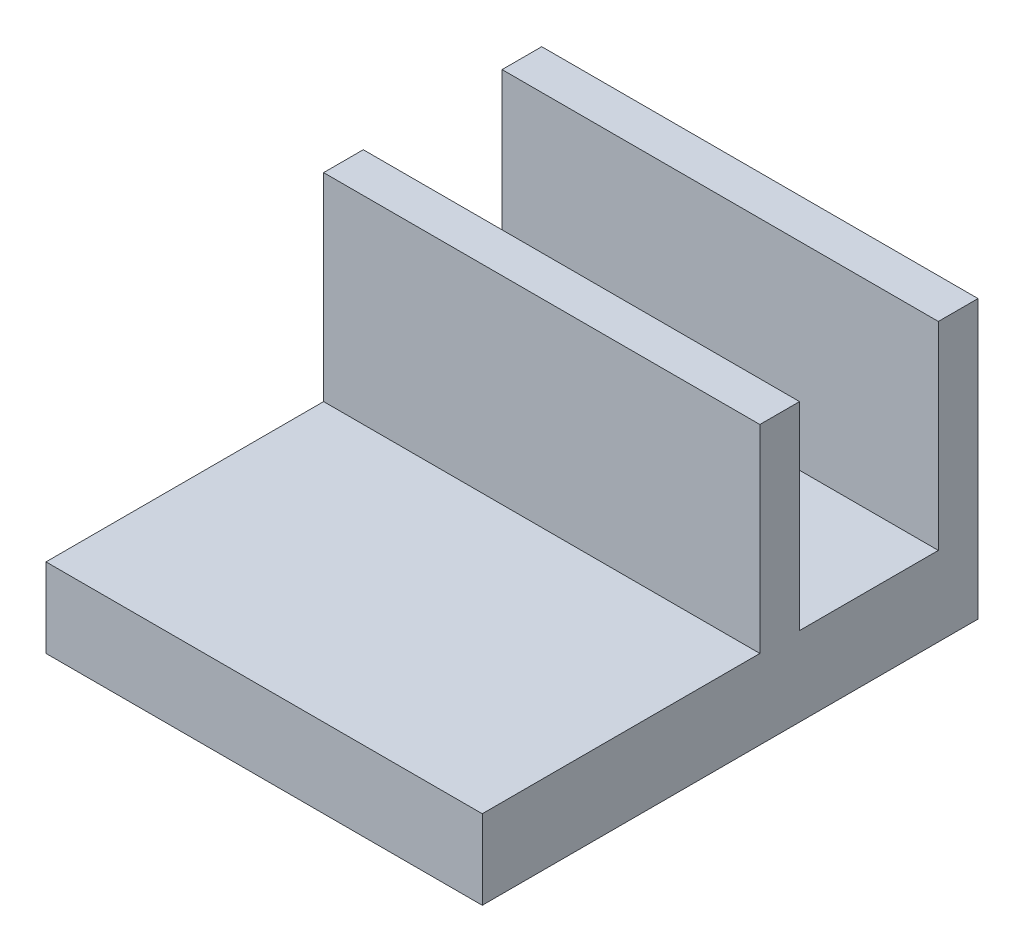
ISO-10303-21;
HEADER;
FILE_DESCRIPTION(('STEP AP214'),'2;1');
FILE_NAME('part.step','',(''),(''),'','','');
FILE_SCHEMA(('AUTOMOTIVE_DESIGN { 1 0 10303 214 1 1 1 1 }'));
ENDSEC;
DATA;
#1=APPLICATION_CONTEXT('core data for automotive mechanical design processes');
#2=APPLICATION_PROTOCOL_DEFINITION('international standard','automotive_design',2000,#1);
#3=PRODUCT_CONTEXT('',#1,'mechanical');
#4=PRODUCT('Part','Part','',(#3));
#5=PRODUCT_RELATED_PRODUCT_CATEGORY('part','',(#4));
#6=PRODUCT_DEFINITION_FORMATION('','',#4);
#7=PRODUCT_DEFINITION_CONTEXT('part definition',#1,'design');
#8=PRODUCT_DEFINITION('design','',#6,#7);
#9=PRODUCT_DEFINITION_SHAPE('','',#8);
#10=(LENGTH_UNIT() NAMED_UNIT(*) SI_UNIT(.MILLI.,.METRE.));
#11=(NAMED_UNIT(*) PLANE_ANGLE_UNIT() SI_UNIT($,.RADIAN.));
#12=(NAMED_UNIT(*) SI_UNIT($,.STERADIAN.) SOLID_ANGLE_UNIT());
#13=UNCERTAINTY_MEASURE_WITH_UNIT(LENGTH_MEASURE(1.E-05),#10,'distance_accuracy_value','');
#14=(GEOMETRIC_REPRESENTATION_CONTEXT(3) GLOBAL_UNCERTAINTY_ASSIGNED_CONTEXT((#13)) GLOBAL_UNIT_ASSIGNED_CONTEXT((#10,
#11,#12)) REPRESENTATION_CONTEXT('',''));
#15=CARTESIAN_POINT('',(0.,0.,0.));
#16=DIRECTION('',(0.,0.,1.));
#17=DIRECTION('',(1.,0.,0.));
#18=AXIS2_PLACEMENT_3D('',#15,#16,#17);
#19=CARTESIAN_POINT('',(0.,4.,0.));
#20=DIRECTION('',(0.,1.,0.));
#21=DIRECTION('',(0.,0.,1.));
#22=AXIS2_PLACEMENT_3D('',#19,#20,#21);
#23=PLANE('',#22);
#24=DIRECTION('',(0.,0.,-1.));
#25=VECTOR('',#24,1.);
#26=CARTESIAN_POINT('',(-23.831985696917,4.,5.44161698032525));
#27=LINE('',#26,#25);
#28=CARTESIAN_POINT('',(-23.831985696917,4.,30.4416169803253));
#29=VERTEX_POINT('',#28);
#30=CARTESIAN_POINT('',(-23.831985696917,4.,16.4416169803253));
#31=VERTEX_POINT('',#30);
#32=EDGE_CURVE('E59',#29,#31,#27,.T.);
#33=ORIENTED_EDGE('',*,*,#32,.T.);
#34=DIRECTION('',(1.,0.,0.));
#35=VECTOR('',#34,1.);
#36=CARTESIAN_POINT('',(0.,4.,16.4416169803253));
#37=LINE('',#36,#35);
#38=CARTESIAN_POINT('',(-45.831985696917,4.,16.4416169803253));
#39=VERTEX_POINT('',#38);
#40=EDGE_CURVE('E211',#39,#31,#37,.T.);
#41=ORIENTED_EDGE('',*,*,#40,.F.);
#42=DIRECTION('',(0.,0.,1.));
#43=VECTOR('',#42,1.);
#44=CARTESIAN_POINT('',(-45.831985696917,4.,5.44161698032525));
#45=LINE('',#44,#43);
#46=CARTESIAN_POINT('',(-45.831985696917,4.,30.4416169803253));
#47=VERTEX_POINT('',#46);
#48=EDGE_CURVE('E136',#39,#47,#45,.T.);
#49=ORIENTED_EDGE('',*,*,#48,.T.);
#50=DIRECTION('',(1.,0.,0.));
#51=VECTOR('',#50,1.);
#52=CARTESIAN_POINT('',(-45.831985696917,4.,30.4416169803253));
#53=LINE('',#52,#51);
#54=EDGE_CURVE('E165',#47,#29,#53,.T.);
#55=ORIENTED_EDGE('',*,*,#54,.T.);
#56=EDGE_LOOP('',(#33,#41,#49,#55));
#57=FACE_BOUND('',#56,.T.);
#58=ADVANCED_FACE('F36',(#57),#23,.T.);
#59=CARTESIAN_POINT('',(-45.831985696917,4.,5.44161698032525));
#60=DIRECTION('',(1.,0.,0.));
#61=DIRECTION('',(0.,0.,-1.));
#62=AXIS2_PLACEMENT_3D('',#59,#60,#61);
#63=PLANE('',#62);
#64=DIRECTION('',(0.,0.,1.));
#65=VECTOR('',#64,1.);
#66=CARTESIAN_POINT('',(-45.831985696917,0.,5.44161698032525));
#67=LINE('',#66,#65);
#68=CARTESIAN_POINT('',(-45.831985696917,0.,5.44161698032525));
#69=VERTEX_POINT('',#68);
#70=CARTESIAN_POINT('',(-45.831985696917,0.,30.4416169803253));
#71=VERTEX_POINT('',#70);
#72=EDGE_CURVE('E162',#69,#71,#67,.T.);
#73=ORIENTED_EDGE('',*,*,#72,.T.);
#74=DIRECTION('',(0.,-1.,0.));
#75=VECTOR('',#74,1.);
#76=CARTESIAN_POINT('',(-45.831985696917,4.,30.4416169803253));
#77=LINE('',#76,#75);
#78=EDGE_CURVE('E11',#47,#71,#77,.T.);
#79=ORIENTED_EDGE('',*,*,#78,.F.);
#80=ORIENTED_EDGE('',*,*,#48,.F.);
#81=DIRECTION('',(0.,-1.,0.));
#82=VECTOR('',#81,1.);
#83=CARTESIAN_POINT('',(-45.831985696917,14.,16.4416169803253));
#84=LINE('',#83,#82);
#85=CARTESIAN_POINT('',(-45.831985696917,14.,16.4416169803253));
#86=VERTEX_POINT('',#85);
#87=EDGE_CURVE('E117',#86,#39,#84,.T.);
#88=ORIENTED_EDGE('',*,*,#87,.F.);
#89=DIRECTION('',(0.,0.,1.));
#90=VECTOR('',#89,1.);
#91=CARTESIAN_POINT('',(-45.831985696917,14.,0.));
#92=LINE('',#91,#90);
#93=CARTESIAN_POINT('',(-45.831985696917,14.,14.4416169803253));
#94=VERTEX_POINT('',#93);
#95=EDGE_CURVE('E123',#94,#86,#92,.T.);
#96=ORIENTED_EDGE('',*,*,#95,.F.);
#97=DIRECTION('',(0.,-1.,0.));
#98=VECTOR('',#97,1.);
#99=CARTESIAN_POINT('',(-45.831985696917,14.,14.4416169803253));
#100=LINE('',#99,#98);
#101=CARTESIAN_POINT('',(-45.831985696917,4.,14.4416169803253));
#102=VERTEX_POINT('',#101);
#103=EDGE_CURVE('E207',#94,#102,#100,.T.);
#104=ORIENTED_EDGE('',*,*,#103,.T.);
#105=CARTESIAN_POINT('',(-45.831985696917,4.,7.44161698032525));
#106=VERTEX_POINT('',#105);
#107=EDGE_CURVE('E163',#106,#102,#45,.T.);
#108=ORIENTED_EDGE('',*,*,#107,.F.);
#109=DIRECTION('',(0.,-1.,0.));
#110=VECTOR('',#109,1.);
#111=CARTESIAN_POINT('',(-45.831985696917,14.,7.44161698032525));
#112=LINE('',#111,#110);
#113=CARTESIAN_POINT('',(-45.831985696917,14.,7.44161698032525));
#114=VERTEX_POINT('',#113);
#115=EDGE_CURVE('E159',#114,#106,#112,.T.);
#116=ORIENTED_EDGE('',*,*,#115,.F.);
#117=DIRECTION('',(0.,0.,1.));
#118=VECTOR('',#117,1.);
#119=CARTESIAN_POINT('',(-45.831985696917,14.,0.));
#120=LINE('',#119,#118);
#121=CARTESIAN_POINT('',(-45.831985696917,14.,5.44161698032525));
#122=VERTEX_POINT('',#121);
#123=EDGE_CURVE('E140',#122,#114,#120,.T.);
#124=ORIENTED_EDGE('',*,*,#123,.F.);
#125=DIRECTION('',(0.,-1.,0.));
#126=VECTOR('',#125,1.);
#127=CARTESIAN_POINT('',(-45.831985696917,4.,5.44161698032525));
#128=LINE('',#127,#126);
#129=EDGE_CURVE('E169',#122,#69,#128,.T.);
#130=ORIENTED_EDGE('',*,*,#129,.T.);
#131=EDGE_LOOP('',(#73,#79,#80,#88,#96,#104,#108,#116,#124,#130));
#132=FACE_BOUND('',#131,.T.);
#133=ADVANCED_FACE('F38',(#132),#63,.F.);
#134=CARTESIAN_POINT('',(-45.831985696917,4.,30.4416169803253));
#135=DIRECTION('',(0.,0.,-1.));
#136=DIRECTION('',(-1.,0.,0.));
#137=AXIS2_PLACEMENT_3D('',#134,#135,#136);
#138=PLANE('',#137);
#139=DIRECTION('',(1.,0.,0.));
#140=VECTOR('',#139,1.);
#141=CARTESIAN_POINT('',(-45.831985696917,0.,30.4416169803253));
#142=LINE('',#141,#140);
#143=CARTESIAN_POINT('',(-23.831985696917,0.,30.4416169803253));
#144=VERTEX_POINT('',#143);
#145=EDGE_CURVE('E171',#71,#144,#142,.T.);
#146=ORIENTED_EDGE('',*,*,#145,.T.);
#147=DIRECTION('',(0.,-1.,0.));
#148=VECTOR('',#147,1.);
#149=CARTESIAN_POINT('',(-23.831985696917,4.,30.4416169803253));
#150=LINE('',#149,#148);
#151=EDGE_CURVE('E44',#29,#144,#150,.T.);
#152=ORIENTED_EDGE('',*,*,#151,.F.);
#153=ORIENTED_EDGE('',*,*,#54,.F.);
#154=ORIENTED_EDGE('',*,*,#78,.T.);
#155=EDGE_LOOP('',(#146,#152,#153,#154));
#156=FACE_BOUND('',#155,.T.);
#157=ADVANCED_FACE('F216',(#156),#138,.F.);
#158=CARTESIAN_POINT('',(-23.831985696917,4.,5.44161698032525));
#159=DIRECTION('',(-1.,0.,0.));
#160=DIRECTION('',(0.,0.,1.));
#161=AXIS2_PLACEMENT_3D('',#158,#159,#160);
#162=PLANE('',#161);
#163=DIRECTION('',(0.,0.,-1.));
#164=VECTOR('',#163,1.);
#165=CARTESIAN_POINT('',(-23.831985696917,0.,5.44161698032525));
#166=LINE('',#165,#164);
#167=CARTESIAN_POINT('',(-23.831985696917,0.,5.44161698032525));
#168=VERTEX_POINT('',#167);
#169=EDGE_CURVE('E173',#144,#168,#166,.T.);
#170=ORIENTED_EDGE('',*,*,#169,.T.);
#171=DIRECTION('',(0.,-1.,0.));
#172=VECTOR('',#171,1.);
#173=CARTESIAN_POINT('',(-23.831985696917,4.,5.44161698032525));
#174=LINE('',#173,#172);
#175=CARTESIAN_POINT('',(-23.831985696917,14.,5.44161698032525));
#176=VERTEX_POINT('',#175);
#177=EDGE_CURVE('E179',#176,#168,#174,.T.);
#178=ORIENTED_EDGE('',*,*,#177,.F.);
#179=DIRECTION('',(0.,0.,-1.));
#180=VECTOR('',#179,1.);
#181=CARTESIAN_POINT('',(-23.831985696917,14.,0.));
#182=LINE('',#181,#180);
#183=CARTESIAN_POINT('',(-23.831985696917,14.,7.44161698032525));
#184=VERTEX_POINT('',#183);
#185=EDGE_CURVE('E150',#184,#176,#182,.T.);
#186=ORIENTED_EDGE('',*,*,#185,.F.);
#187=DIRECTION('',(0.,-1.,0.));
#188=VECTOR('',#187,1.);
#189=CARTESIAN_POINT('',(-23.831985696917,14.,7.44161698032525));
#190=LINE('',#189,#188);
#191=CARTESIAN_POINT('',(-23.831985696917,4.,7.44161698032525));
#192=VERTEX_POINT('',#191);
#193=EDGE_CURVE('E155',#184,#192,#190,.T.);
#194=ORIENTED_EDGE('',*,*,#193,.T.);
#195=CARTESIAN_POINT('',(-23.831985696917,4.,14.4416169803253));
#196=VERTEX_POINT('',#195);
#197=EDGE_CURVE('E167',#196,#192,#27,.T.);
#198=ORIENTED_EDGE('',*,*,#197,.F.);
#199=DIRECTION('',(0.,-1.,0.));
#200=VECTOR('',#199,1.);
#201=CARTESIAN_POINT('',(-23.831985696917,14.,14.4416169803253));
#202=LINE('',#201,#200);
#203=CARTESIAN_POINT('',(-23.831985696917,14.,14.4416169803253));
#204=VERTEX_POINT('',#203);
#205=EDGE_CURVE('E142',#204,#196,#202,.T.);
#206=ORIENTED_EDGE('',*,*,#205,.F.);
#207=DIRECTION('',(0.,0.,-1.));
#208=VECTOR('',#207,1.);
#209=CARTESIAN_POINT('',(-23.831985696917,14.,0.));
#210=LINE('',#209,#208);
#211=CARTESIAN_POINT('',(-23.831985696917,14.,16.4416169803253));
#212=VERTEX_POINT('',#211);
#213=EDGE_CURVE('E122',#212,#204,#210,.T.);
#214=ORIENTED_EDGE('',*,*,#213,.F.);
#215=DIRECTION('',(0.,-1.,0.));
#216=VECTOR('',#215,1.);
#217=CARTESIAN_POINT('',(-23.831985696917,14.,16.4416169803253));
#218=LINE('',#217,#216);
#219=EDGE_CURVE('E119',#212,#31,#218,.T.);
#220=ORIENTED_EDGE('',*,*,#219,.T.);
#221=ORIENTED_EDGE('',*,*,#32,.F.);
#222=ORIENTED_EDGE('',*,*,#151,.T.);
#223=EDGE_LOOP('',(#170,#178,#186,#194,#198,#206,#214,#220,#221,#222));
#224=FACE_BOUND('',#223,.T.);
#225=ADVANCED_FACE('F185',(#224),#162,.F.);
#226=CARTESIAN_POINT('',(-45.831985696917,4.,5.44161698032525));
#227=DIRECTION('',(0.,0.,1.));
#228=DIRECTION('',(1.,0.,0.));
#229=AXIS2_PLACEMENT_3D('',#226,#227,#228);
#230=PLANE('',#229);
#231=DIRECTION('',(-1.,0.,0.));
#232=VECTOR('',#231,1.);
#233=CARTESIAN_POINT('',(-45.831985696917,0.,5.44161698032525));
#234=LINE('',#233,#232);
#235=EDGE_CURVE('E175',#168,#69,#234,.T.);
#236=ORIENTED_EDGE('',*,*,#235,.T.);
#237=ORIENTED_EDGE('',*,*,#129,.F.);
#238=DIRECTION('',(-1.,0.,0.));
#239=VECTOR('',#238,1.);
#240=CARTESIAN_POINT('',(0.,14.,5.44161698032525));
#241=LINE('',#240,#239);
#242=EDGE_CURVE('E153',#176,#122,#241,.T.);
#243=ORIENTED_EDGE('',*,*,#242,.F.);
#244=ORIENTED_EDGE('',*,*,#177,.T.);
#245=EDGE_LOOP('',(#236,#237,#243,#244));
#246=FACE_BOUND('',#245,.T.);
#247=ADVANCED_FACE('F193',(#246),#230,.F.);
#248=DIRECTION('',(1.,0.,0.));
#249=VECTOR('',#248,1.);
#250=CARTESIAN_POINT('',(0.,4.,14.4416169803253));
#251=LINE('',#250,#249);
#252=EDGE_CURVE('E51',#102,#196,#251,.T.);
#253=ORIENTED_EDGE('',*,*,#252,.T.);
#254=ORIENTED_EDGE('',*,*,#197,.T.);
#255=DIRECTION('',(1.,0.,0.));
#256=VECTOR('',#255,1.);
#257=CARTESIAN_POINT('',(0.,4.,7.44161698032526));
#258=LINE('',#257,#256);
#259=EDGE_CURVE('E137',#106,#192,#258,.T.);
#260=ORIENTED_EDGE('',*,*,#259,.F.);
#261=ORIENTED_EDGE('',*,*,#107,.T.);
#262=EDGE_LOOP('',(#253,#254,#260,#261));
#263=FACE_BOUND('',#262,.T.);
#264=ADVANCED_FACE('F206',(#263),#23,.T.);
#265=CARTESIAN_POINT('',(0.,0.,0.));
#266=DIRECTION('',(0.,1.,0.));
#267=DIRECTION('',(0.,0.,1.));
#268=AXIS2_PLACEMENT_3D('',#265,#266,#267);
#269=PLANE('',#268);
#270=ORIENTED_EDGE('',*,*,#72,.F.);
#271=ORIENTED_EDGE('',*,*,#235,.F.);
#272=ORIENTED_EDGE('',*,*,#169,.F.);
#273=ORIENTED_EDGE('',*,*,#145,.F.);
#274=EDGE_LOOP('',(#270,#271,#272,#273));
#275=FACE_BOUND('',#274,.T.);
#276=ADVANCED_FACE('F191',(#275),#269,.F.);
#277=CARTESIAN_POINT('',(0.,14.,7.44161698032526));
#278=DIRECTION('',(0.,0.,-1.));
#279=DIRECTION('',(-1.,0.,0.));
#280=AXIS2_PLACEMENT_3D('',#277,#278,#279);
#281=PLANE('',#280);
#282=ORIENTED_EDGE('',*,*,#259,.T.);
#283=ORIENTED_EDGE('',*,*,#193,.F.);
#284=DIRECTION('',(1.,0.,0.));
#285=VECTOR('',#284,1.);
#286=CARTESIAN_POINT('',(0.,14.,7.44161698032526));
#287=LINE('',#286,#285);
#288=EDGE_CURVE('E148',#114,#184,#287,.T.);
#289=ORIENTED_EDGE('',*,*,#288,.F.);
#290=ORIENTED_EDGE('',*,*,#115,.T.);
#291=EDGE_LOOP('',(#282,#283,#289,#290));
#292=FACE_BOUND('',#291,.T.);
#293=ADVANCED_FACE('F205',(#292),#281,.F.);
#294=CARTESIAN_POINT('',(0.,14.,0.));
#295=DIRECTION('',(0.,1.,0.));
#296=DIRECTION('',(0.,0.,1.));
#297=AXIS2_PLACEMENT_3D('',#294,#295,#296);
#298=PLANE('',#297);
#299=ORIENTED_EDGE('',*,*,#123,.T.);
#300=ORIENTED_EDGE('',*,*,#288,.T.);
#301=ORIENTED_EDGE('',*,*,#185,.T.);
#302=ORIENTED_EDGE('',*,*,#242,.T.);
#303=EDGE_LOOP('',(#299,#300,#301,#302));
#304=FACE_BOUND('',#303,.T.);
#305=ADVANCED_FACE('F199',(#304),#298,.T.);
#306=CARTESIAN_POINT('',(0.,14.,16.4416169803253));
#307=DIRECTION('',(0.,0.,-1.));
#308=DIRECTION('',(-1.,0.,0.));
#309=AXIS2_PLACEMENT_3D('',#306,#307,#308);
#310=PLANE('',#309);
#311=ORIENTED_EDGE('',*,*,#40,.T.);
#312=ORIENTED_EDGE('',*,*,#219,.F.);
#313=DIRECTION('',(1.,0.,0.));
#314=VECTOR('',#313,1.);
#315=CARTESIAN_POINT('',(0.,14.,16.4416169803253));
#316=LINE('',#315,#314);
#317=EDGE_CURVE('E113',#86,#212,#316,.T.);
#318=ORIENTED_EDGE('',*,*,#317,.F.);
#319=ORIENTED_EDGE('',*,*,#87,.T.);
#320=EDGE_LOOP('',(#311,#312,#318,#319));
#321=FACE_BOUND('',#320,.T.);
#322=ADVANCED_FACE('F115',(#321),#310,.F.);
#323=CARTESIAN_POINT('',(0.,14.,14.4416169803253));
#324=DIRECTION('',(0.,0.,-1.));
#325=DIRECTION('',(-1.,0.,0.));
#326=AXIS2_PLACEMENT_3D('',#323,#324,#325);
#327=PLANE('',#326);
#328=ORIENTED_EDGE('',*,*,#252,.F.);
#329=ORIENTED_EDGE('',*,*,#103,.F.);
#330=DIRECTION('',(1.,0.,0.));
#331=VECTOR('',#330,1.);
#332=CARTESIAN_POINT('',(0.,14.,14.4416169803253));
#333=LINE('',#332,#331);
#334=EDGE_CURVE('E129',#94,#204,#333,.T.);
#335=ORIENTED_EDGE('',*,*,#334,.T.);
#336=ORIENTED_EDGE('',*,*,#205,.T.);
#337=EDGE_LOOP('',(#328,#329,#335,#336));
#338=FACE_BOUND('',#337,.T.);
#339=ADVANCED_FACE('F210',(#338),#327,.T.);
#340=CARTESIAN_POINT('',(0.,14.,0.));
#341=DIRECTION('',(0.,1.,0.));
#342=DIRECTION('',(0.,0.,1.));
#343=AXIS2_PLACEMENT_3D('',#340,#341,#342);
#344=PLANE('',#343);
#345=ORIENTED_EDGE('',*,*,#95,.T.);
#346=ORIENTED_EDGE('',*,*,#317,.T.);
#347=ORIENTED_EDGE('',*,*,#213,.T.);
#348=ORIENTED_EDGE('',*,*,#334,.F.);
#349=EDGE_LOOP('',(#345,#346,#347,#348));
#350=FACE_BOUND('',#349,.T.);
#351=ADVANCED_FACE('F127',(#350),#344,.T.);
#352=CLOSED_SHELL('',(#58,#133,#157,#225,#247,#264,#276,#293,#305,#322,#339,#351));
#353=MANIFOLD_SOLID_BREP('B2',#352);
#354=ADVANCED_BREP_SHAPE_REPRESENTATION('',(#18,#353),#14);
#355=SHAPE_DEFINITION_REPRESENTATION(#9,#354);
ENDSEC;
END-ISO-10303-21;
